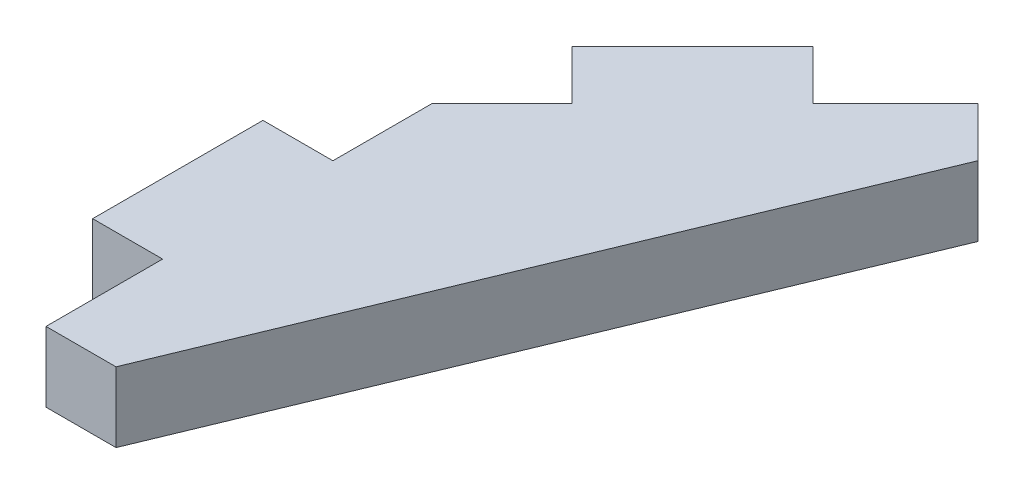
ISO-10303-21;
HEADER;
FILE_DESCRIPTION(('STEP AP214'),'2;1');
FILE_NAME('part.step','',(''),(''),'','','');
FILE_SCHEMA(('AUTOMOTIVE_DESIGN { 1 0 10303 214 1 1 1 1 }'));
ENDSEC;
DATA;
#1=APPLICATION_CONTEXT('core data for automotive mechanical design processes');
#2=APPLICATION_PROTOCOL_DEFINITION('international standard','automotive_design',2000,#1);
#3=PRODUCT_CONTEXT('',#1,'mechanical');
#4=PRODUCT('Part','Part','',(#3));
#5=PRODUCT_RELATED_PRODUCT_CATEGORY('part','',(#4));
#6=PRODUCT_DEFINITION_FORMATION('','',#4);
#7=PRODUCT_DEFINITION_CONTEXT('part definition',#1,'design');
#8=PRODUCT_DEFINITION('design','',#6,#7);
#9=PRODUCT_DEFINITION_SHAPE('','',#8);
#10=(LENGTH_UNIT() NAMED_UNIT(*) SI_UNIT(.MILLI.,.METRE.));
#11=(NAMED_UNIT(*) PLANE_ANGLE_UNIT() SI_UNIT($,.RADIAN.));
#12=(NAMED_UNIT(*) SI_UNIT($,.STERADIAN.) SOLID_ANGLE_UNIT());
#13=UNCERTAINTY_MEASURE_WITH_UNIT(LENGTH_MEASURE(1.E-05),#10,'distance_accuracy_value','');
#14=(GEOMETRIC_REPRESENTATION_CONTEXT(3) GLOBAL_UNCERTAINTY_ASSIGNED_CONTEXT((#13)) GLOBAL_UNIT_ASSIGNED_CONTEXT((#10,
#11,#12)) REPRESENTATION_CONTEXT('',''));
#15=CARTESIAN_POINT('',(0.,0.,0.));
#16=DIRECTION('',(0.,0.,1.));
#17=DIRECTION('',(1.,0.,0.));
#18=AXIS2_PLACEMENT_3D('',#15,#16,#17);
#19=CARTESIAN_POINT('',(11.7026172286374,3.,-11.7026172286374));
#20=DIRECTION('',(-0.707106781186549,0.,0.707106781186546));
#21=DIRECTION('',(0.707106781186546,0.,0.707106781186549));
#22=AXIS2_PLACEMENT_3D('',#19,#20,#21);
#23=PLANE('',#22);
#24=DIRECTION('',(-0.707106781186546,0.,-0.707106781186549));
#25=VECTOR('',#24,1.);
#26=CARTESIAN_POINT('',(11.7026172286374,0.,-11.7026172286374));
#27=LINE('',#26,#25);
#28=CARTESIAN_POINT('',(13.8244806065674,0.,-9.58075385070745));
#29=VERTEX_POINT('',#28);
#30=CARTESIAN_POINT('',(11.7026172286374,0.,-11.7026172286374));
#31=VERTEX_POINT('',#30);
#32=EDGE_CURVE('E159',#29,#31,#27,.T.);
#33=ORIENTED_EDGE('',*,*,#32,.T.);
#34=DIRECTION('',(0.,-1.,0.));
#35=VECTOR('',#34,1.);
#36=CARTESIAN_POINT('',(11.7026172286374,3.,-11.7026172286374));
#37=LINE('',#36,#35);
#38=CARTESIAN_POINT('',(11.7026172286374,3.,-11.7026172286374));
#39=VERTEX_POINT('',#38);
#40=EDGE_CURVE('E11',#39,#31,#37,.T.);
#41=ORIENTED_EDGE('',*,*,#40,.F.);
#42=DIRECTION('',(-0.707106781186546,0.,-0.707106781186549));
#43=VECTOR('',#42,1.);
#44=CARTESIAN_POINT('',(11.7026172286374,3.,-11.7026172286374));
#45=LINE('',#44,#43);
#46=CARTESIAN_POINT('',(13.8244806065674,3.,-9.58075385070745));
#47=VERTEX_POINT('',#46);
#48=EDGE_CURVE('E183',#47,#39,#45,.T.);
#49=ORIENTED_EDGE('',*,*,#48,.F.);
#50=DIRECTION('',(0.,-1.,0.));
#51=VECTOR('',#50,1.);
#52=CARTESIAN_POINT('',(13.8244806065674,3.,-9.58075385070745));
#53=LINE('',#52,#51);
#54=EDGE_CURVE('E155',#47,#29,#53,.T.);
#55=ORIENTED_EDGE('',*,*,#54,.T.);
#56=EDGE_LOOP('',(#33,#41,#49,#55));
#57=FACE_BOUND('',#56,.T.);
#58=ADVANCED_FACE('F33',(#57),#23,.F.);
#59=CARTESIAN_POINT('',(8.16708332270468,3.,-8.16708332270465));
#60=DIRECTION('',(0.707106781186546,0.,0.707106781186549));
#61=DIRECTION('',(0.707106781186549,0.,-0.707106781186546));
#62=AXIS2_PLACEMENT_3D('',#59,#60,#61);
#63=PLANE('',#62);
#64=DIRECTION('',(-0.707106781186549,0.,0.707106781186546));
#65=VECTOR('',#64,1.);
#66=CARTESIAN_POINT('',(8.16708332270468,0.,-8.16708332270465));
#67=LINE('',#66,#65);
#68=CARTESIAN_POINT('',(8.16708332270468,0.,-8.16708332270465));
#69=VERTEX_POINT('',#68);
#70=EDGE_CURVE('E162',#31,#69,#67,.T.);
#71=ORIENTED_EDGE('',*,*,#70,.T.);
#72=DIRECTION('',(0.,-1.,0.));
#73=VECTOR('',#72,1.);
#74=CARTESIAN_POINT('',(8.16708332270468,3.,-8.16708332270465));
#75=LINE('',#74,#73);
#76=CARTESIAN_POINT('',(8.16708332270468,3.,-8.16708332270465));
#77=VERTEX_POINT('',#76);
#78=EDGE_CURVE('E41',#77,#69,#75,.T.);
#79=ORIENTED_EDGE('',*,*,#78,.F.);
#80=DIRECTION('',(-0.707106781186549,0.,0.707106781186546));
#81=VECTOR('',#80,1.);
#82=CARTESIAN_POINT('',(8.16708332270468,3.,-8.16708332270465));
#83=LINE('',#82,#81);
#84=EDGE_CURVE('E107',#39,#77,#83,.T.);
#85=ORIENTED_EDGE('',*,*,#84,.F.);
#86=ORIENTED_EDGE('',*,*,#40,.T.);
#87=EDGE_LOOP('',(#71,#79,#85,#86));
#88=FACE_BOUND('',#87,.T.);
#89=ADVANCED_FACE('F266',(#88),#63,.F.);
#90=CARTESIAN_POINT('',(6.045762979145,3.,-10.2884036662643));
#91=DIRECTION('',(-0.707106781186535,0.,0.70710678118656));
#92=DIRECTION('',(0.70710678118656,0.,0.707106781186535));
#93=AXIS2_PLACEMENT_3D('',#90,#91,#92);
#94=PLANE('',#93);
#95=DIRECTION('',(-0.70710678118656,0.,-0.707106781186535));
#96=VECTOR('',#95,1.);
#97=CARTESIAN_POINT('',(6.045762979145,0.,-10.2884036662643));
#98=LINE('',#97,#96);
#99=CARTESIAN_POINT('',(6.045762979145,0.,-10.2884036662643));
#100=VERTEX_POINT('',#99);
#101=EDGE_CURVE('E164',#69,#100,#98,.T.);
#102=ORIENTED_EDGE('',*,*,#101,.T.);
#103=DIRECTION('',(0.,-1.,0.));
#104=VECTOR('',#103,1.);
#105=CARTESIAN_POINT('',(6.045762979145,3.,-10.2884036662643));
#106=LINE('',#105,#104);
#107=CARTESIAN_POINT('',(6.045762979145,3.,-10.2884036662643));
#108=VERTEX_POINT('',#107);
#109=EDGE_CURVE('E205',#108,#100,#106,.T.);
#110=ORIENTED_EDGE('',*,*,#109,.F.);
#111=DIRECTION('',(-0.70710678118656,0.,-0.707106781186535));
#112=VECTOR('',#111,1.);
#113=CARTESIAN_POINT('',(6.045762979145,3.,-10.2884036662643));
#114=LINE('',#113,#112);
#115=EDGE_CURVE('E213',#77,#108,#114,.T.);
#116=ORIENTED_EDGE('',*,*,#115,.F.);
#117=ORIENTED_EDGE('',*,*,#78,.T.);
#118=EDGE_LOOP('',(#102,#110,#116,#117));
#119=FACE_BOUND('',#118,.T.);
#120=ADVANCED_FACE('F211',(#119),#94,.F.);
#121=CARTESIAN_POINT('',(0.883883476483192,3.,-5.12652416360247));
#122=DIRECTION('',(0.707106781186546,0.,0.707106781186549));
#123=DIRECTION('',(0.707106781186549,0.,-0.707106781186546));
#124=AXIS2_PLACEMENT_3D('',#121,#122,#123);
#125=PLANE('',#124);
#126=DIRECTION('',(-0.707106781186549,0.,0.707106781186546));
#127=VECTOR('',#126,1.);
#128=CARTESIAN_POINT('',(0.883883476483192,0.,-5.12652416360247));
#129=LINE('',#128,#127);
#130=CARTESIAN_POINT('',(0.883883476483192,0.,-5.12652416360247));
#131=VERTEX_POINT('',#130);
#132=EDGE_CURVE('E166',#100,#131,#129,.T.);
#133=ORIENTED_EDGE('',*,*,#132,.T.);
#134=DIRECTION('',(0.,-1.,0.));
#135=VECTOR('',#134,1.);
#136=CARTESIAN_POINT('',(0.883883476483192,3.,-5.12652416360247));
#137=LINE('',#136,#135);
#138=CARTESIAN_POINT('',(0.883883476483192,3.,-5.12652416360247));
#139=VERTEX_POINT('',#138);
#140=EDGE_CURVE('E202',#139,#131,#137,.T.);
#141=ORIENTED_EDGE('',*,*,#140,.F.);
#142=DIRECTION('',(-0.707106781186549,0.,0.707106781186546));
#143=VECTOR('',#142,1.);
#144=CARTESIAN_POINT('',(0.883883476483192,3.,-5.12652416360247));
#145=LINE('',#144,#143);
#146=EDGE_CURVE('E231',#108,#139,#145,.T.);
#147=ORIENTED_EDGE('',*,*,#146,.F.);
#148=ORIENTED_EDGE('',*,*,#109,.T.);
#149=EDGE_LOOP('',(#133,#141,#147,#148));
#150=FACE_BOUND('',#149,.T.);
#151=ADVANCED_FACE('F222',(#150),#125,.F.);
#152=CARTESIAN_POINT('',(3.00520382004283,3.,-3.00520382004282));
#153=DIRECTION('',(0.707106781186549,0.,-0.707106781186547));
#154=DIRECTION('',(-0.707106781186547,0.,-0.707106781186549));
#155=AXIS2_PLACEMENT_3D('',#152,#153,#154);
#156=PLANE('',#155);
#157=DIRECTION('',(0.707106781186546,0.,0.707106781186548));
#158=VECTOR('',#157,1.);
#159=CARTESIAN_POINT('',(3.00520382004283,0.,-3.00520382004282));
#160=LINE('',#159,#158);
#161=CARTESIAN_POINT('',(3.00520382004283,0.,-3.00520382004282));
#162=VERTEX_POINT('',#161);
#163=EDGE_CURVE('E168',#131,#162,#160,.T.);
#164=ORIENTED_EDGE('',*,*,#163,.T.);
#165=DIRECTION('',(0.,-1.,0.));
#166=VECTOR('',#165,1.);
#167=CARTESIAN_POINT('',(3.00520382004283,3.,-3.00520382004282));
#168=LINE('',#167,#166);
#169=CARTESIAN_POINT('',(3.00520382004283,3.,-3.00520382004282));
#170=VERTEX_POINT('',#169);
#171=EDGE_CURVE('E199',#170,#162,#168,.T.);
#172=ORIENTED_EDGE('',*,*,#171,.F.);
#173=DIRECTION('',(0.707106781186546,0.,0.707106781186548));
#174=VECTOR('',#173,1.);
#175=CARTESIAN_POINT('',(3.00520382004283,3.,-3.00520382004282));
#176=LINE('',#175,#174);
#177=EDGE_CURVE('E228',#139,#170,#176,.T.);
#178=ORIENTED_EDGE('',*,*,#177,.F.);
#179=ORIENTED_EDGE('',*,*,#140,.T.);
#180=EDGE_LOOP('',(#164,#172,#178,#179));
#181=FACE_BOUND('',#180,.T.);
#182=ADVANCED_FACE('F226',(#181),#156,.F.);
#183=CARTESIAN_POINT('',(0.,3.,0.));
#184=DIRECTION('',(0.707106781186546,0.,0.707106781186548));
#185=DIRECTION('',(0.707106781186549,0.,-0.707106781186546));
#186=AXIS2_PLACEMENT_3D('',#183,#184,#185);
#187=PLANE('',#186);
#188=DIRECTION('',(-0.707106781186549,0.,0.707106781186546));
#189=VECTOR('',#188,1.);
#190=CARTESIAN_POINT('',(0.,0.,0.));
#191=LINE('',#190,#189);
#192=CARTESIAN_POINT('',(0.,0.,0.));
#193=VERTEX_POINT('',#192);
#194=EDGE_CURVE('E170',#162,#193,#191,.T.);
#195=ORIENTED_EDGE('',*,*,#194,.T.);
#196=DIRECTION('',(0.,-1.,0.));
#197=VECTOR('',#196,1.);
#198=CARTESIAN_POINT('',(0.,3.,0.));
#199=LINE('',#198,#197);
#200=CARTESIAN_POINT('',(0.,3.,0.));
#201=VERTEX_POINT('',#200);
#202=EDGE_CURVE('E196',#201,#193,#199,.T.);
#203=ORIENTED_EDGE('',*,*,#202,.F.);
#204=DIRECTION('',(-0.707106781186549,0.,0.707106781186546));
#205=VECTOR('',#204,1.);
#206=CARTESIAN_POINT('',(0.,3.,0.));
#207=LINE('',#206,#205);
#208=EDGE_CURVE('E230',#170,#201,#207,.T.);
#209=ORIENTED_EDGE('',*,*,#208,.F.);
#210=ORIENTED_EDGE('',*,*,#171,.T.);
#211=EDGE_LOOP('',(#195,#203,#209,#210));
#212=FACE_BOUND('',#211,.T.);
#213=ADVANCED_FACE('F279',(#212),#187,.F.);
#214=CARTESIAN_POINT('',(0.,3.,4.25));
#215=DIRECTION('',(1.,0.,0.));
#216=DIRECTION('',(0.,0.,-1.));
#217=AXIS2_PLACEMENT_3D('',#214,#215,#216);
#218=PLANE('',#217);
#219=DIRECTION('',(0.,0.,1.));
#220=VECTOR('',#219,1.);
#221=CARTESIAN_POINT('',(0.,0.,4.25));
#222=LINE('',#221,#220);
#223=CARTESIAN_POINT('',(0.,0.,4.25));
#224=VERTEX_POINT('',#223);
#225=EDGE_CURVE('E172',#193,#224,#222,.T.);
#226=ORIENTED_EDGE('',*,*,#225,.T.);
#227=DIRECTION('',(0.,-1.,0.));
#228=VECTOR('',#227,1.);
#229=CARTESIAN_POINT('',(0.,3.,4.25));
#230=LINE('',#229,#228);
#231=CARTESIAN_POINT('',(0.,3.,4.25));
#232=VERTEX_POINT('',#231);
#233=EDGE_CURVE('E193',#232,#224,#230,.T.);
#234=ORIENTED_EDGE('',*,*,#233,.F.);
#235=DIRECTION('',(0.,0.,1.));
#236=VECTOR('',#235,1.);
#237=CARTESIAN_POINT('',(0.,3.,4.25));
#238=LINE('',#237,#236);
#239=EDGE_CURVE('E233',#201,#232,#238,.T.);
#240=ORIENTED_EDGE('',*,*,#239,.F.);
#241=ORIENTED_EDGE('',*,*,#202,.T.);
#242=EDGE_LOOP('',(#226,#234,#240,#241));
#243=FACE_BOUND('',#242,.T.);
#244=ADVANCED_FACE('F282',(#243),#218,.F.);
#245=CARTESIAN_POINT('',(-3.,3.,4.25));
#246=DIRECTION('',(0.,0.,1.));
#247=DIRECTION('',(1.,0.,0.));
#248=AXIS2_PLACEMENT_3D('',#245,#246,#247);
#249=PLANE('',#248);
#250=DIRECTION('',(-1.,0.,0.));
#251=VECTOR('',#250,1.);
#252=CARTESIAN_POINT('',(-3.,0.,4.25));
#253=LINE('',#252,#251);
#254=CARTESIAN_POINT('',(-3.,0.,4.25));
#255=VERTEX_POINT('',#254);
#256=EDGE_CURVE('E174',#224,#255,#253,.T.);
#257=ORIENTED_EDGE('',*,*,#256,.T.);
#258=DIRECTION('',(0.,-1.,0.));
#259=VECTOR('',#258,1.);
#260=CARTESIAN_POINT('',(-3.,3.,4.25));
#261=LINE('',#260,#259);
#262=CARTESIAN_POINT('',(-3.,3.,4.25));
#263=VERTEX_POINT('',#262);
#264=EDGE_CURVE('E190',#263,#255,#261,.T.);
#265=ORIENTED_EDGE('',*,*,#264,.F.);
#266=DIRECTION('',(-1.,0.,0.));
#267=VECTOR('',#266,1.);
#268=CARTESIAN_POINT('',(-3.,3.,4.25));
#269=LINE('',#268,#267);
#270=EDGE_CURVE('E239',#232,#263,#269,.T.);
#271=ORIENTED_EDGE('',*,*,#270,.F.);
#272=ORIENTED_EDGE('',*,*,#233,.T.);
#273=EDGE_LOOP('',(#257,#265,#271,#272));
#274=FACE_BOUND('',#273,.T.);
#275=ADVANCED_FACE('F286',(#274),#249,.F.);
#276=CARTESIAN_POINT('',(-3.,3.,11.55));
#277=DIRECTION('',(1.,0.,0.));
#278=DIRECTION('',(0.,0.,-1.));
#279=AXIS2_PLACEMENT_3D('',#276,#277,#278);
#280=PLANE('',#279);
#281=DIRECTION('',(0.,0.,1.));
#282=VECTOR('',#281,1.);
#283=CARTESIAN_POINT('',(-3.,0.,11.55));
#284=LINE('',#283,#282);
#285=CARTESIAN_POINT('',(-3.,0.,11.55));
#286=VERTEX_POINT('',#285);
#287=EDGE_CURVE('E176',#255,#286,#284,.T.);
#288=ORIENTED_EDGE('',*,*,#287,.T.);
#289=DIRECTION('',(0.,-1.,0.));
#290=VECTOR('',#289,1.);
#291=CARTESIAN_POINT('',(-3.,3.,11.55));
#292=LINE('',#291,#290);
#293=CARTESIAN_POINT('',(-3.,3.,11.55));
#294=VERTEX_POINT('',#293);
#295=EDGE_CURVE('E187',#294,#286,#292,.T.);
#296=ORIENTED_EDGE('',*,*,#295,.F.);
#297=DIRECTION('',(0.,0.,1.));
#298=VECTOR('',#297,1.);
#299=CARTESIAN_POINT('',(-3.,3.,11.55));
#300=LINE('',#299,#298);
#301=EDGE_CURVE('E241',#263,#294,#300,.T.);
#302=ORIENTED_EDGE('',*,*,#301,.F.);
#303=ORIENTED_EDGE('',*,*,#264,.T.);
#304=EDGE_LOOP('',(#288,#296,#302,#303));
#305=FACE_BOUND('',#304,.T.);
#306=ADVANCED_FACE('F247',(#305),#280,.F.);
#307=CARTESIAN_POINT('',(0.,3.,11.55));
#308=DIRECTION('',(0.,0.,-1.));
#309=DIRECTION('',(-1.,0.,0.));
#310=AXIS2_PLACEMENT_3D('',#307,#308,#309);
#311=PLANE('',#310);
#312=DIRECTION('',(1.,0.,0.));
#313=VECTOR('',#312,1.);
#314=CARTESIAN_POINT('',(0.,0.,11.55));
#315=LINE('',#314,#313);
#316=CARTESIAN_POINT('',(0.,0.,11.55));
#317=VERTEX_POINT('',#316);
#318=EDGE_CURVE('E178',#286,#317,#315,.T.);
#319=ORIENTED_EDGE('',*,*,#318,.T.);
#320=DIRECTION('',(0.,-1.,0.));
#321=VECTOR('',#320,1.);
#322=CARTESIAN_POINT('',(0.,3.,11.55));
#323=LINE('',#322,#321);
#324=CARTESIAN_POINT('',(0.,3.,11.55));
#325=VERTEX_POINT('',#324);
#326=EDGE_CURVE('E150',#325,#317,#323,.T.);
#327=ORIENTED_EDGE('',*,*,#326,.F.);
#328=DIRECTION('',(1.,0.,0.));
#329=VECTOR('',#328,1.);
#330=CARTESIAN_POINT('',(0.,3.,11.55));
#331=LINE('',#330,#329);
#332=EDGE_CURVE('E141',#294,#325,#331,.T.);
#333=ORIENTED_EDGE('',*,*,#332,.F.);
#334=ORIENTED_EDGE('',*,*,#295,.T.);
#335=EDGE_LOOP('',(#319,#327,#333,#334));
#336=FACE_BOUND('',#335,.T.);
#337=ADVANCED_FACE('F251',(#336),#311,.F.);
#338=CARTESIAN_POINT('',(0.,3.,16.55));
#339=DIRECTION('',(1.,0.,0.));
#340=DIRECTION('',(0.,0.,-1.));
#341=AXIS2_PLACEMENT_3D('',#338,#339,#340);
#342=PLANE('',#341);
#343=DIRECTION('',(0.,0.,1.));
#344=VECTOR('',#343,1.);
#345=CARTESIAN_POINT('',(0.,0.,16.55));
#346=LINE('',#345,#344);
#347=CARTESIAN_POINT('',(0.,0.,16.55));
#348=VERTEX_POINT('',#347);
#349=EDGE_CURVE('E149',#317,#348,#346,.T.);
#350=ORIENTED_EDGE('',*,*,#349,.T.);
#351=DIRECTION('',(0.,-1.,0.));
#352=VECTOR('',#351,1.);
#353=CARTESIAN_POINT('',(0.,3.,16.55));
#354=LINE('',#353,#352);
#355=CARTESIAN_POINT('',(0.,3.,16.55));
#356=VERTEX_POINT('',#355);
#357=EDGE_CURVE('E146',#356,#348,#354,.T.);
#358=ORIENTED_EDGE('',*,*,#357,.F.);
#359=DIRECTION('',(0.,0.,1.));
#360=VECTOR('',#359,1.);
#361=CARTESIAN_POINT('',(0.,3.,16.55));
#362=LINE('',#361,#360);
#363=EDGE_CURVE('E135',#325,#356,#362,.T.);
#364=ORIENTED_EDGE('',*,*,#363,.F.);
#365=ORIENTED_EDGE('',*,*,#326,.T.);
#366=EDGE_LOOP('',(#350,#358,#364,#365));
#367=FACE_BOUND('',#366,.T.);
#368=ADVANCED_FACE('F147',(#367),#342,.F.);
#369=CARTESIAN_POINT('',(3.0007679665713,3.,16.55));
#370=DIRECTION('',(0.,0.,-1.));
#371=DIRECTION('',(-1.,0.,0.));
#372=AXIS2_PLACEMENT_3D('',#369,#370,#371);
#373=PLANE('',#372);
#374=DIRECTION('',(1.,0.,0.));
#375=VECTOR('',#374,1.);
#376=CARTESIAN_POINT('',(3.0007679665713,0.,16.55));
#377=LINE('',#376,#375);
#378=CARTESIAN_POINT('',(3.0007679665713,0.,16.55));
#379=VERTEX_POINT('',#378);
#380=EDGE_CURVE('E93',#348,#379,#377,.T.);
#381=ORIENTED_EDGE('',*,*,#380,.T.);
#382=DIRECTION('',(0.,-1.,0.));
#383=VECTOR('',#382,1.);
#384=CARTESIAN_POINT('',(3.0007679665713,3.,16.55));
#385=LINE('',#384,#383);
#386=CARTESIAN_POINT('',(3.0007679665713,3.,16.55));
#387=VERTEX_POINT('',#386);
#388=EDGE_CURVE('E151',#387,#379,#385,.T.);
#389=ORIENTED_EDGE('',*,*,#388,.F.);
#390=DIRECTION('',(1.,0.,0.));
#391=VECTOR('',#390,1.);
#392=CARTESIAN_POINT('',(3.0007679665713,3.,16.55));
#393=LINE('',#392,#391);
#394=EDGE_CURVE('E139',#356,#387,#393,.T.);
#395=ORIENTED_EDGE('',*,*,#394,.F.);
#396=ORIENTED_EDGE('',*,*,#357,.T.);
#397=EDGE_LOOP('',(#381,#389,#395,#396));
#398=FACE_BOUND('',#397,.T.);
#399=ADVANCED_FACE('F153',(#398),#373,.F.);
#400=CARTESIAN_POINT('',(13.8244806065674,3.,-9.58075385070745));
#401=DIRECTION('',(-0.923879532511286,0.,-0.382683432365091));
#402=DIRECTION('',(-0.382683432365091,0.,0.923879532511286));
#403=AXIS2_PLACEMENT_3D('',#400,#401,#402);
#404=PLANE('',#403);
#405=DIRECTION('',(0.382683432365091,0.,-0.923879532511286));
#406=VECTOR('',#405,1.);
#407=CARTESIAN_POINT('',(13.8244806065674,0.,-9.58075385070745));
#408=LINE('',#407,#406);
#409=EDGE_CURVE('E99',#379,#29,#408,.T.);
#410=ORIENTED_EDGE('',*,*,#409,.T.);
#411=ORIENTED_EDGE('',*,*,#54,.F.);
#412=DIRECTION('',(0.382683432365091,0.,-0.923879532511286));
#413=VECTOR('',#412,1.);
#414=CARTESIAN_POINT('',(13.8244806065674,3.,-9.58075385070745));
#415=LINE('',#414,#413);
#416=EDGE_CURVE('E49',#387,#47,#415,.T.);
#417=ORIENTED_EDGE('',*,*,#416,.F.);
#418=ORIENTED_EDGE('',*,*,#388,.T.);
#419=EDGE_LOOP('',(#410,#411,#417,#418));
#420=FACE_BOUND('',#419,.T.);
#421=ADVANCED_FACE('F255',(#420),#404,.F.);
#422=CARTESIAN_POINT('',(0.,3.,0.));
#423=DIRECTION('',(0.,1.,0.));
#424=DIRECTION('',(0.,0.,1.));
#425=AXIS2_PLACEMENT_3D('',#422,#423,#424);
#426=PLANE('',#425);
#427=ORIENTED_EDGE('',*,*,#48,.T.);
#428=ORIENTED_EDGE('',*,*,#84,.T.);
#429=ORIENTED_EDGE('',*,*,#115,.T.);
#430=ORIENTED_EDGE('',*,*,#146,.T.);
#431=ORIENTED_EDGE('',*,*,#177,.T.);
#432=ORIENTED_EDGE('',*,*,#208,.T.);
#433=ORIENTED_EDGE('',*,*,#239,.T.);
#434=ORIENTED_EDGE('',*,*,#270,.T.);
#435=ORIENTED_EDGE('',*,*,#301,.T.);
#436=ORIENTED_EDGE('',*,*,#332,.T.);
#437=ORIENTED_EDGE('',*,*,#363,.T.);
#438=ORIENTED_EDGE('',*,*,#394,.T.);
#439=ORIENTED_EDGE('',*,*,#416,.T.);
#440=EDGE_LOOP('',(#427,#428,#429,#430,#431,#432,#433,#434,#435,#436,#437,#438,#439));
#441=FACE_BOUND('',#440,.T.);
#442=ADVANCED_FACE('F137',(#441),#426,.T.);
#443=CARTESIAN_POINT('',(0.,0.,0.));
#444=DIRECTION('',(0.,1.,0.));
#445=DIRECTION('',(0.,0.,1.));
#446=AXIS2_PLACEMENT_3D('',#443,#444,#445);
#447=PLANE('',#446);
#448=ORIENTED_EDGE('',*,*,#32,.F.);
#449=ORIENTED_EDGE('',*,*,#409,.F.);
#450=ORIENTED_EDGE('',*,*,#380,.F.);
#451=ORIENTED_EDGE('',*,*,#349,.F.);
#452=ORIENTED_EDGE('',*,*,#318,.F.);
#453=ORIENTED_EDGE('',*,*,#287,.F.);
#454=ORIENTED_EDGE('',*,*,#256,.F.);
#455=ORIENTED_EDGE('',*,*,#225,.F.);
#456=ORIENTED_EDGE('',*,*,#194,.F.);
#457=ORIENTED_EDGE('',*,*,#163,.F.);
#458=ORIENTED_EDGE('',*,*,#132,.F.);
#459=ORIENTED_EDGE('',*,*,#101,.F.);
#460=ORIENTED_EDGE('',*,*,#70,.F.);
#461=EDGE_LOOP('',(#448,#449,#450,#451,#452,#453,#454,#455,#456,#457,#458,#459,#460));
#462=FACE_BOUND('',#461,.T.);
#463=ADVANCED_FACE('F217',(#462),#447,.F.);
#464=CLOSED_SHELL('',(#58,#89,#120,#151,#182,#213,#244,#275,#306,#337,#368,#399,#421,#442,#463));
#465=MANIFOLD_SOLID_BREP('B2',#464);
#466=ADVANCED_BREP_SHAPE_REPRESENTATION('',(#18,#465),#14);
#467=SHAPE_DEFINITION_REPRESENTATION(#9,#466);
ENDSEC;
END-ISO-10303-21;
